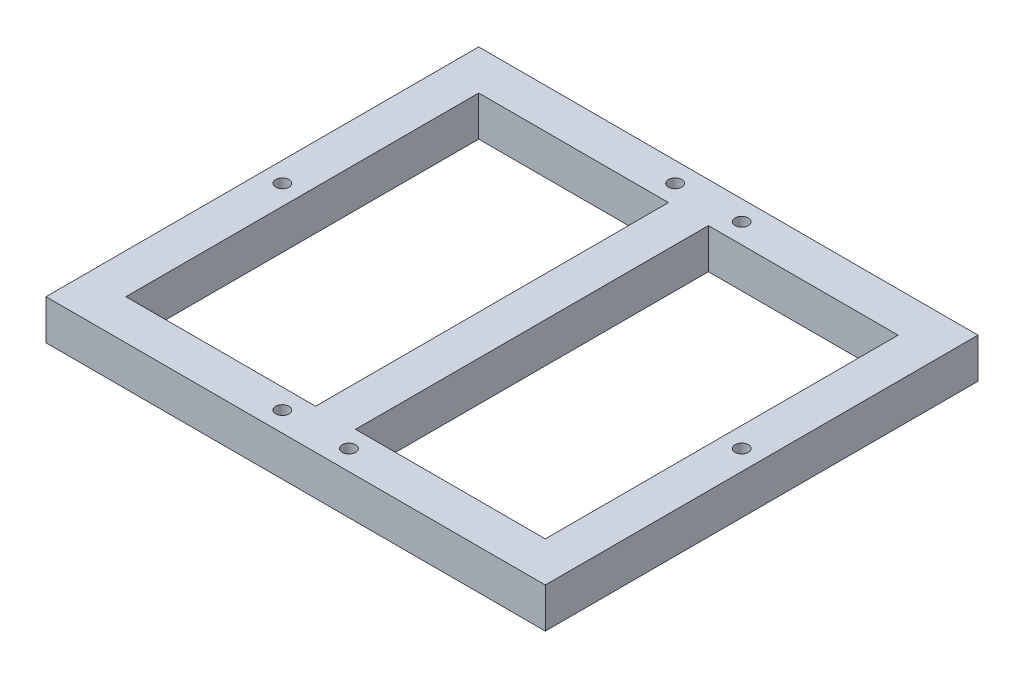
ISO-10303-21;
HEADER;
FILE_DESCRIPTION(('STEP AP214'),'2;1');
FILE_NAME('part.step','',(''),(''),'','','');
FILE_SCHEMA(('AUTOMOTIVE_DESIGN { 1 0 10303 214 1 1 1 1 }'));
ENDSEC;
DATA;
#1=APPLICATION_CONTEXT('core data for automotive mechanical design processes');
#2=APPLICATION_PROTOCOL_DEFINITION('international standard','automotive_design',2000,#1);
#3=PRODUCT_CONTEXT('',#1,'mechanical');
#4=PRODUCT('Part','Part','',(#3));
#5=PRODUCT_RELATED_PRODUCT_CATEGORY('part','',(#4));
#6=PRODUCT_DEFINITION_FORMATION('','',#4);
#7=PRODUCT_DEFINITION_CONTEXT('part definition',#1,'design');
#8=PRODUCT_DEFINITION('design','',#6,#7);
#9=PRODUCT_DEFINITION_SHAPE('','',#8);
#10=(LENGTH_UNIT() NAMED_UNIT(*) SI_UNIT(.MILLI.,.METRE.));
#11=(NAMED_UNIT(*) PLANE_ANGLE_UNIT() SI_UNIT($,.RADIAN.));
#12=(NAMED_UNIT(*) SI_UNIT($,.STERADIAN.) SOLID_ANGLE_UNIT());
#13=UNCERTAINTY_MEASURE_WITH_UNIT(LENGTH_MEASURE(1.E-05),#10,'distance_accuracy_value','');
#14=(GEOMETRIC_REPRESENTATION_CONTEXT(3) GLOBAL_UNCERTAINTY_ASSIGNED_CONTEXT((#13)) GLOBAL_UNIT_ASSIGNED_CONTEXT((#10,
#11,#12)) REPRESENTATION_CONTEXT('',''));
#15=CARTESIAN_POINT('',(0.,0.,0.));
#16=DIRECTION('',(0.,0.,1.));
#17=DIRECTION('',(1.,0.,0.));
#18=AXIS2_PLACEMENT_3D('',#15,#16,#17);
#19=CARTESIAN_POINT('',(0.,6.,0.));
#20=DIRECTION('',(0.,-1.,0.));
#21=DIRECTION('',(0.,0.,-1.));
#22=AXIS2_PLACEMENT_3D('',#19,#20,#21);
#23=PLANE('',#22);
#24=CARTESIAN_POINT('',(-69.,6.,0.));
#25=DIRECTION('',(0.,1.,0.));
#26=DIRECTION('',(0.,0.,1.));
#27=AXIS2_PLACEMENT_3D('',#24,#25,#26);
#28=CIRCLE('',#27,2.);
#29=CARTESIAN_POINT('',(-69.,6.,2.));
#30=VERTEX_POINT('',#29);
#31=EDGE_CURVE('E329',#30,#30,#28,.T.);
#32=ORIENTED_EDGE('',*,*,#31,.F.);
#33=EDGE_LOOP('',(#32));
#34=FACE_BOUND('',#33,.T.);
#35=CARTESIAN_POINT('',(9.99999999999998,6.,-59.));
#36=DIRECTION('',(0.,1.,0.));
#37=DIRECTION('',(0.,0.,1.));
#38=AXIS2_PLACEMENT_3D('',#35,#36,#37);
#39=CIRCLE('',#38,2.);
#40=CARTESIAN_POINT('',(9.99999999999998,6.,-57.));
#41=VERTEX_POINT('',#40);
#42=EDGE_CURVE('E341',#41,#41,#39,.T.);
#43=ORIENTED_EDGE('',*,*,#42,.F.);
#44=EDGE_LOOP('',(#43));
#45=FACE_BOUND('',#44,.T.);
#46=CARTESIAN_POINT('',(69.,6.,0.));
#47=DIRECTION('',(0.,1.,0.));
#48=DIRECTION('',(0.,0.,-1.));
#49=AXIS2_PLACEMENT_3D('',#46,#47,#48);
#50=CIRCLE('',#49,2.);
#51=CARTESIAN_POINT('',(69.,6.,-2.));
#52=VERTEX_POINT('',#51);
#53=EDGE_CURVE('E334',#52,#52,#50,.T.);
#54=ORIENTED_EDGE('',*,*,#53,.F.);
#55=EDGE_LOOP('',(#54));
#56=FACE_BOUND('',#55,.T.);
#57=CARTESIAN_POINT('',(-9.99999999999998,6.,59.));
#58=DIRECTION('',(0.,1.,0.));
#59=DIRECTION('',(0.,0.,1.));
#60=AXIS2_PLACEMENT_3D('',#57,#58,#59);
#61=CIRCLE('',#60,2.);
#62=CARTESIAN_POINT('',(-9.99999999999998,6.,61.));
#63=VERTEX_POINT('',#62);
#64=EDGE_CURVE('E347',#63,#63,#61,.T.);
#65=ORIENTED_EDGE('',*,*,#64,.F.);
#66=EDGE_LOOP('',(#65));
#67=FACE_BOUND('',#66,.T.);
#68=CARTESIAN_POINT('',(9.99999999999998,6.,59.));
#69=DIRECTION('',(0.,1.,0.));
#70=DIRECTION('',(0.,0.,-1.));
#71=AXIS2_PLACEMENT_3D('',#68,#69,#70);
#72=CIRCLE('',#71,2.);
#73=CARTESIAN_POINT('',(9.99999999999998,6.,57.));
#74=VERTEX_POINT('',#73);
#75=EDGE_CURVE('E348',#74,#74,#72,.T.);
#76=ORIENTED_EDGE('',*,*,#75,.F.);
#77=EDGE_LOOP('',(#76));
#78=FACE_BOUND('',#77,.T.);
#79=CARTESIAN_POINT('',(-9.99999999999998,6.,-59.));
#80=DIRECTION('',(0.,1.,0.));
#81=DIRECTION('',(0.,0.,-1.));
#82=AXIS2_PLACEMENT_3D('',#79,#80,#81);
#83=CIRCLE('',#82,2.);
#84=CARTESIAN_POINT('',(-9.99999999999998,6.,-61.));
#85=VERTEX_POINT('',#84);
#86=EDGE_CURVE('E340',#85,#85,#83,.T.);
#87=ORIENTED_EDGE('',*,*,#86,.F.);
#88=EDGE_LOOP('',(#87));
#89=FACE_BOUND('',#88,.T.);
#90=DIRECTION('',(1.,0.,0.));
#91=VECTOR('',#90,1.);
#92=CARTESIAN_POINT('',(-63.,6.,53.));
#93=LINE('',#92,#91);
#94=CARTESIAN_POINT('',(-63.,6.,53.));
#95=VERTEX_POINT('',#94);
#96=CARTESIAN_POINT('',(-5.99999999999999,6.,53.));
#97=VERTEX_POINT('',#96);
#98=EDGE_CURVE('E162',#95,#97,#93,.T.);
#99=ORIENTED_EDGE('',*,*,#98,.F.);
#100=DIRECTION('',(0.,0.,1.));
#101=VECTOR('',#100,1.);
#102=CARTESIAN_POINT('',(-63.,6.,53.));
#103=LINE('',#102,#101);
#104=CARTESIAN_POINT('',(-63.,6.,-53.));
#105=VERTEX_POINT('',#104);
#106=EDGE_CURVE('E170',#105,#95,#103,.T.);
#107=ORIENTED_EDGE('',*,*,#106,.F.);
#108=DIRECTION('',(-1.,0.,0.));
#109=VECTOR('',#108,1.);
#110=CARTESIAN_POINT('',(-63.,6.,-53.));
#111=LINE('',#110,#109);
#112=CARTESIAN_POINT('',(-6.,6.,-53.));
#113=VERTEX_POINT('',#112);
#114=EDGE_CURVE('E167',#113,#105,#111,.T.);
#115=ORIENTED_EDGE('',*,*,#114,.F.);
#116=DIRECTION('',(0.,0.,-1.));
#117=VECTOR('',#116,1.);
#118=CARTESIAN_POINT('',(-6.,6.,-53.));
#119=LINE('',#118,#117);
#120=EDGE_CURVE('E164',#97,#113,#119,.T.);
#121=ORIENTED_EDGE('',*,*,#120,.F.);
#122=EDGE_LOOP('',(#99,#107,#115,#121));
#123=FACE_BOUND('',#122,.T.);
#124=DIRECTION('',(0.,0.,-1.));
#125=VECTOR('',#124,1.);
#126=CARTESIAN_POINT('',(75.,6.,65.));
#127=LINE('',#126,#125);
#128=CARTESIAN_POINT('',(75.,6.,65.));
#129=VERTEX_POINT('',#128);
#130=CARTESIAN_POINT('',(75.,6.,-65.));
#131=VERTEX_POINT('',#130);
#132=EDGE_CURVE('E193',#129,#131,#127,.T.);
#133=ORIENTED_EDGE('',*,*,#132,.T.);
#134=DIRECTION('',(-1.,0.,0.));
#135=VECTOR('',#134,1.);
#136=CARTESIAN_POINT('',(-75.,6.,-65.));
#137=LINE('',#136,#135);
#138=CARTESIAN_POINT('',(-75.,6.,-65.));
#139=VERTEX_POINT('',#138);
#140=EDGE_CURVE('E196',#131,#139,#137,.T.);
#141=ORIENTED_EDGE('',*,*,#140,.T.);
#142=DIRECTION('',(0.,0.,1.));
#143=VECTOR('',#142,1.);
#144=CARTESIAN_POINT('',(-75.,6.,65.));
#145=LINE('',#144,#143);
#146=CARTESIAN_POINT('',(-75.,6.,65.));
#147=VERTEX_POINT('',#146);
#148=EDGE_CURVE('E199',#139,#147,#145,.T.);
#149=ORIENTED_EDGE('',*,*,#148,.T.);
#150=DIRECTION('',(1.,0.,0.));
#151=VECTOR('',#150,1.);
#152=CARTESIAN_POINT('',(-75.,6.,65.));
#153=LINE('',#152,#151);
#154=EDGE_CURVE('E201',#147,#129,#153,.T.);
#155=ORIENTED_EDGE('',*,*,#154,.T.);
#156=EDGE_LOOP('',(#133,#141,#149,#155));
#157=FACE_BOUND('',#156,.T.);
#158=DIRECTION('',(-1.,0.,0.));
#159=VECTOR('',#158,1.);
#160=CARTESIAN_POINT('',(6.,6.,-53.));
#161=LINE('',#160,#159);
#162=CARTESIAN_POINT('',(63.,6.,-53.));
#163=VERTEX_POINT('',#162);
#164=CARTESIAN_POINT('',(6.,6.,-53.));
#165=VERTEX_POINT('',#164);
#166=EDGE_CURVE('E124',#163,#165,#161,.T.);
#167=ORIENTED_EDGE('',*,*,#166,.F.);
#168=DIRECTION('',(0.,0.,-1.));
#169=VECTOR('',#168,1.);
#170=CARTESIAN_POINT('',(63.,6.,53.));
#171=LINE('',#170,#169);
#172=CARTESIAN_POINT('',(63.,6.,53.));
#173=VERTEX_POINT('',#172);
#174=EDGE_CURVE('E146',#173,#163,#171,.T.);
#175=ORIENTED_EDGE('',*,*,#174,.F.);
#176=DIRECTION('',(1.,0.,0.));
#177=VECTOR('',#176,1.);
#178=CARTESIAN_POINT('',(5.99999999999999,6.,53.));
#179=LINE('',#178,#177);
#180=CARTESIAN_POINT('',(5.99999999999999,6.,53.));
#181=VERTEX_POINT('',#180);
#182=EDGE_CURVE('E144',#181,#173,#179,.T.);
#183=ORIENTED_EDGE('',*,*,#182,.F.);
#184=DIRECTION('',(0.,0.,1.));
#185=VECTOR('',#184,1.);
#186=CARTESIAN_POINT('',(6.,6.,-53.));
#187=LINE('',#186,#185);
#188=EDGE_CURVE('E132',#165,#181,#187,.T.);
#189=ORIENTED_EDGE('',*,*,#188,.F.);
#190=EDGE_LOOP('',(#167,#175,#183,#189));
#191=FACE_BOUND('',#190,.T.);
#192=ADVANCED_FACE('F35',(#34,#45,#56,#67,#78,#89,#123,#157,#191),#23,.F.);
#193=CARTESIAN_POINT('',(0.,-6.,0.));
#194=DIRECTION('',(0.,-1.,0.));
#195=DIRECTION('',(0.,0.,-1.));
#196=AXIS2_PLACEMENT_3D('',#193,#194,#195);
#197=PLANE('',#196);
#198=CARTESIAN_POINT('',(-69.,-6.,0.));
#199=DIRECTION('',(0.,1.,0.));
#200=DIRECTION('',(0.,0.,1.));
#201=AXIS2_PLACEMENT_3D('',#198,#199,#200);
#202=CIRCLE('',#201,2.);
#203=CARTESIAN_POINT('',(-69.,-6.,2.));
#204=VERTEX_POINT('',#203);
#205=EDGE_CURVE('E152',#204,#204,#202,.T.);
#206=ORIENTED_EDGE('',*,*,#205,.T.);
#207=EDGE_LOOP('',(#206));
#208=FACE_BOUND('',#207,.T.);
#209=CARTESIAN_POINT('',(9.99999999999998,-6.,-59.));
#210=DIRECTION('',(0.,1.,0.));
#211=DIRECTION('',(0.,0.,1.));
#212=AXIS2_PLACEMENT_3D('',#209,#210,#211);
#213=CIRCLE('',#212,2.);
#214=CARTESIAN_POINT('',(9.99999999999998,-6.,-57.));
#215=VERTEX_POINT('',#214);
#216=EDGE_CURVE('E337',#215,#215,#213,.T.);
#217=ORIENTED_EDGE('',*,*,#216,.T.);
#218=EDGE_LOOP('',(#217));
#219=FACE_BOUND('',#218,.T.);
#220=CARTESIAN_POINT('',(69.,-6.,0.));
#221=DIRECTION('',(0.,1.,0.));
#222=DIRECTION('',(0.,0.,-1.));
#223=AXIS2_PLACEMENT_3D('',#220,#221,#222);
#224=CIRCLE('',#223,2.);
#225=CARTESIAN_POINT('',(69.,-6.,-2.));
#226=VERTEX_POINT('',#225);
#227=EDGE_CURVE('E330',#226,#226,#224,.T.);
#228=ORIENTED_EDGE('',*,*,#227,.T.);
#229=EDGE_LOOP('',(#228));
#230=FACE_BOUND('',#229,.T.);
#231=CARTESIAN_POINT('',(-9.99999999999998,-6.,59.));
#232=DIRECTION('',(0.,1.,0.));
#233=DIRECTION('',(0.,0.,1.));
#234=AXIS2_PLACEMENT_3D('',#231,#232,#233);
#235=CIRCLE('',#234,2.);
#236=CARTESIAN_POINT('',(-9.99999999999998,-6.,61.));
#237=VERTEX_POINT('',#236);
#238=EDGE_CURVE('E358',#237,#237,#235,.T.);
#239=ORIENTED_EDGE('',*,*,#238,.T.);
#240=EDGE_LOOP('',(#239));
#241=FACE_BOUND('',#240,.T.);
#242=CARTESIAN_POINT('',(9.99999999999998,-6.,59.));
#243=DIRECTION('',(0.,1.,0.));
#244=DIRECTION('',(0.,0.,-1.));
#245=AXIS2_PLACEMENT_3D('',#242,#243,#244);
#246=CIRCLE('',#245,2.);
#247=CARTESIAN_POINT('',(9.99999999999998,-6.,57.));
#248=VERTEX_POINT('',#247);
#249=EDGE_CURVE('E344',#248,#248,#246,.T.);
#250=ORIENTED_EDGE('',*,*,#249,.T.);
#251=EDGE_LOOP('',(#250));
#252=FACE_BOUND('',#251,.T.);
#253=CARTESIAN_POINT('',(-9.99999999999998,-6.,-59.));
#254=DIRECTION('',(0.,1.,0.));
#255=DIRECTION('',(0.,0.,-1.));
#256=AXIS2_PLACEMENT_3D('',#253,#254,#255);
#257=CIRCLE('',#256,2.);
#258=CARTESIAN_POINT('',(-9.99999999999998,-6.,-61.));
#259=VERTEX_POINT('',#258);
#260=EDGE_CURVE('E351',#259,#259,#257,.T.);
#261=ORIENTED_EDGE('',*,*,#260,.T.);
#262=EDGE_LOOP('',(#261));
#263=FACE_BOUND('',#262,.T.);
#264=DIRECTION('',(0.,0.,-1.));
#265=VECTOR('',#264,1.);
#266=CARTESIAN_POINT('',(75.,-6.,65.));
#267=LINE('',#266,#265);
#268=CARTESIAN_POINT('',(75.,-6.,65.));
#269=VERTEX_POINT('',#268);
#270=CARTESIAN_POINT('',(75.,-6.,-65.));
#271=VERTEX_POINT('',#270);
#272=EDGE_CURVE('E192',#269,#271,#267,.T.);
#273=ORIENTED_EDGE('',*,*,#272,.F.);
#274=DIRECTION('',(1.,0.,0.));
#275=VECTOR('',#274,1.);
#276=CARTESIAN_POINT('',(-75.,-6.,65.));
#277=LINE('',#276,#275);
#278=CARTESIAN_POINT('',(-75.,-6.,65.));
#279=VERTEX_POINT('',#278);
#280=EDGE_CURVE('E197',#279,#269,#277,.T.);
#281=ORIENTED_EDGE('',*,*,#280,.F.);
#282=DIRECTION('',(0.,0.,1.));
#283=VECTOR('',#282,1.);
#284=CARTESIAN_POINT('',(-75.,-6.,65.));
#285=LINE('',#284,#283);
#286=CARTESIAN_POINT('',(-75.,-6.,-65.));
#287=VERTEX_POINT('',#286);
#288=EDGE_CURVE('E208',#287,#279,#285,.T.);
#289=ORIENTED_EDGE('',*,*,#288,.F.);
#290=DIRECTION('',(-1.,0.,0.));
#291=VECTOR('',#290,1.);
#292=CARTESIAN_POINT('',(-75.,-6.,-65.));
#293=LINE('',#292,#291);
#294=EDGE_CURVE('E206',#271,#287,#293,.T.);
#295=ORIENTED_EDGE('',*,*,#294,.F.);
#296=EDGE_LOOP('',(#273,#281,#289,#295));
#297=FACE_BOUND('',#296,.T.);
#298=DIRECTION('',(0.,0.,1.));
#299=VECTOR('',#298,1.);
#300=CARTESIAN_POINT('',(-63.,-6.,53.));
#301=LINE('',#300,#299);
#302=CARTESIAN_POINT('',(-63.,-6.,-53.));
#303=VERTEX_POINT('',#302);
#304=CARTESIAN_POINT('',(-63.,-6.,53.));
#305=VERTEX_POINT('',#304);
#306=EDGE_CURVE('E165',#303,#305,#301,.T.);
#307=ORIENTED_EDGE('',*,*,#306,.T.);
#308=DIRECTION('',(1.,0.,0.));
#309=VECTOR('',#308,1.);
#310=CARTESIAN_POINT('',(-63.,-6.,53.));
#311=LINE('',#310,#309);
#312=CARTESIAN_POINT('',(-5.99999999999999,-6.,53.));
#313=VERTEX_POINT('',#312);
#314=EDGE_CURVE('E140',#305,#313,#311,.T.);
#315=ORIENTED_EDGE('',*,*,#314,.T.);
#316=DIRECTION('',(0.,0.,-1.));
#317=VECTOR('',#316,1.);
#318=CARTESIAN_POINT('',(-6.,-6.,-53.));
#319=LINE('',#318,#317);
#320=CARTESIAN_POINT('',(-6.,-6.,-53.));
#321=VERTEX_POINT('',#320);
#322=EDGE_CURVE('E175',#313,#321,#319,.T.);
#323=ORIENTED_EDGE('',*,*,#322,.T.);
#324=DIRECTION('',(-1.,0.,0.));
#325=VECTOR('',#324,1.);
#326=CARTESIAN_POINT('',(-63.,-6.,-53.));
#327=LINE('',#326,#325);
#328=EDGE_CURVE('E178',#321,#303,#327,.T.);
#329=ORIENTED_EDGE('',*,*,#328,.T.);
#330=EDGE_LOOP('',(#307,#315,#323,#329));
#331=FACE_BOUND('',#330,.T.);
#332=DIRECTION('',(0.,0.,-1.));
#333=VECTOR('',#332,1.);
#334=CARTESIAN_POINT('',(63.,-6.,53.));
#335=LINE('',#334,#333);
#336=CARTESIAN_POINT('',(63.,-6.,53.));
#337=VERTEX_POINT('',#336);
#338=CARTESIAN_POINT('',(63.,-6.,-53.));
#339=VERTEX_POINT('',#338);
#340=EDGE_CURVE('E133',#337,#339,#335,.T.);
#341=ORIENTED_EDGE('',*,*,#340,.T.);
#342=DIRECTION('',(-1.,0.,0.));
#343=VECTOR('',#342,1.);
#344=CARTESIAN_POINT('',(6.,-6.,-53.));
#345=LINE('',#344,#343);
#346=CARTESIAN_POINT('',(6.,-6.,-53.));
#347=VERTEX_POINT('',#346);
#348=EDGE_CURVE('E58',#339,#347,#345,.T.);
#349=ORIENTED_EDGE('',*,*,#348,.T.);
#350=DIRECTION('',(0.,0.,1.));
#351=VECTOR('',#350,1.);
#352=CARTESIAN_POINT('',(6.,-6.,-53.));
#353=LINE('',#352,#351);
#354=CARTESIAN_POINT('',(5.99999999999999,-6.,53.));
#355=VERTEX_POINT('',#354);
#356=EDGE_CURVE('E139',#347,#355,#353,.T.);
#357=ORIENTED_EDGE('',*,*,#356,.T.);
#358=DIRECTION('',(1.,0.,0.));
#359=VECTOR('',#358,1.);
#360=CARTESIAN_POINT('',(5.99999999999999,-6.,53.));
#361=LINE('',#360,#359);
#362=EDGE_CURVE('E154',#355,#337,#361,.T.);
#363=ORIENTED_EDGE('',*,*,#362,.T.);
#364=EDGE_LOOP('',(#341,#349,#357,#363));
#365=FACE_BOUND('',#364,.T.);
#366=ADVANCED_FACE('F226',(#208,#219,#230,#241,#252,#263,#297,#331,#365),#197,.T.);
#367=CARTESIAN_POINT('',(75.,6.,65.));
#368=DIRECTION('',(-1.,0.,0.));
#369=DIRECTION('',(0.,0.,1.));
#370=AXIS2_PLACEMENT_3D('',#367,#368,#369);
#371=PLANE('',#370);
#372=ORIENTED_EDGE('',*,*,#272,.T.);
#373=DIRECTION('',(0.,-1.,0.));
#374=VECTOR('',#373,1.);
#375=CARTESIAN_POINT('',(75.,6.,-65.));
#376=LINE('',#375,#374);
#377=EDGE_CURVE('E11',#131,#271,#376,.T.);
#378=ORIENTED_EDGE('',*,*,#377,.F.);
#379=ORIENTED_EDGE('',*,*,#132,.F.);
#380=DIRECTION('',(0.,-1.,0.));
#381=VECTOR('',#380,1.);
#382=CARTESIAN_POINT('',(75.,6.,65.));
#383=LINE('',#382,#381);
#384=EDGE_CURVE('E203',#129,#269,#383,.T.);
#385=ORIENTED_EDGE('',*,*,#384,.T.);
#386=EDGE_LOOP('',(#372,#378,#379,#385));
#387=FACE_BOUND('',#386,.T.);
#388=ADVANCED_FACE('F37',(#387),#371,.F.);
#389=CARTESIAN_POINT('',(-75.,6.,-65.));
#390=DIRECTION('',(0.,0.,1.));
#391=DIRECTION('',(1.,0.,0.));
#392=AXIS2_PLACEMENT_3D('',#389,#390,#391);
#393=PLANE('',#392);
#394=ORIENTED_EDGE('',*,*,#294,.T.);
#395=DIRECTION('',(0.,-1.,0.));
#396=VECTOR('',#395,1.);
#397=CARTESIAN_POINT('',(-75.,6.,-65.));
#398=LINE('',#397,#396);
#399=EDGE_CURVE('E43',#139,#287,#398,.T.);
#400=ORIENTED_EDGE('',*,*,#399,.F.);
#401=ORIENTED_EDGE('',*,*,#140,.F.);
#402=ORIENTED_EDGE('',*,*,#377,.T.);
#403=EDGE_LOOP('',(#394,#400,#401,#402));
#404=FACE_BOUND('',#403,.T.);
#405=ADVANCED_FACE('F236',(#404),#393,.F.);
#406=CARTESIAN_POINT('',(-75.,6.,65.));
#407=DIRECTION('',(1.,0.,0.));
#408=DIRECTION('',(0.,0.,-1.));
#409=AXIS2_PLACEMENT_3D('',#406,#407,#408);
#410=PLANE('',#409);
#411=ORIENTED_EDGE('',*,*,#288,.T.);
#412=DIRECTION('',(0.,-1.,0.));
#413=VECTOR('',#412,1.);
#414=CARTESIAN_POINT('',(-75.,6.,65.));
#415=LINE('',#414,#413);
#416=EDGE_CURVE('E213',#147,#279,#415,.T.);
#417=ORIENTED_EDGE('',*,*,#416,.F.);
#418=ORIENTED_EDGE('',*,*,#148,.F.);
#419=ORIENTED_EDGE('',*,*,#399,.T.);
#420=EDGE_LOOP('',(#411,#417,#418,#419));
#421=FACE_BOUND('',#420,.T.);
#422=ADVANCED_FACE('F220',(#421),#410,.F.);
#423=CARTESIAN_POINT('',(-75.,6.,65.));
#424=DIRECTION('',(0.,0.,-1.));
#425=DIRECTION('',(-1.,0.,0.));
#426=AXIS2_PLACEMENT_3D('',#423,#424,#425);
#427=PLANE('',#426);
#428=ORIENTED_EDGE('',*,*,#280,.T.);
#429=ORIENTED_EDGE('',*,*,#384,.F.);
#430=ORIENTED_EDGE('',*,*,#154,.F.);
#431=ORIENTED_EDGE('',*,*,#416,.T.);
#432=EDGE_LOOP('',(#428,#429,#430,#431));
#433=FACE_BOUND('',#432,.T.);
#434=ADVANCED_FACE('F230',(#433),#427,.F.);
#435=CARTESIAN_POINT('',(-63.,6.,53.));
#436=DIRECTION('',(0.,0.,-1.));
#437=DIRECTION('',(-1.,0.,0.));
#438=AXIS2_PLACEMENT_3D('',#435,#436,#437);
#439=PLANE('',#438);
#440=ORIENTED_EDGE('',*,*,#314,.F.);
#441=DIRECTION('',(0.,-1.,0.));
#442=VECTOR('',#441,1.);
#443=CARTESIAN_POINT('',(-63.,6.,53.));
#444=LINE('',#443,#442);
#445=EDGE_CURVE('E172',#95,#305,#444,.T.);
#446=ORIENTED_EDGE('',*,*,#445,.F.);
#447=ORIENTED_EDGE('',*,*,#98,.T.);
#448=DIRECTION('',(0.,-1.,0.));
#449=VECTOR('',#448,1.);
#450=CARTESIAN_POINT('',(-5.99999999999999,6.,53.));
#451=LINE('',#450,#449);
#452=EDGE_CURVE('E189',#97,#313,#451,.T.);
#453=ORIENTED_EDGE('',*,*,#452,.T.);
#454=EDGE_LOOP('',(#440,#446,#447,#453));
#455=FACE_BOUND('',#454,.T.);
#456=ADVANCED_FACE('F254',(#455),#439,.T.);
#457=CARTESIAN_POINT('',(-6.,6.,-53.));
#458=DIRECTION('',(-1.,0.,0.));
#459=DIRECTION('',(0.,0.,1.));
#460=AXIS2_PLACEMENT_3D('',#457,#458,#459);
#461=PLANE('',#460);
#462=ORIENTED_EDGE('',*,*,#322,.F.);
#463=ORIENTED_EDGE('',*,*,#452,.F.);
#464=ORIENTED_EDGE('',*,*,#120,.T.);
#465=DIRECTION('',(0.,-1.,0.));
#466=VECTOR('',#465,1.);
#467=CARTESIAN_POINT('',(-6.,6.,-53.));
#468=LINE('',#467,#466);
#469=EDGE_CURVE('E187',#113,#321,#468,.T.);
#470=ORIENTED_EDGE('',*,*,#469,.T.);
#471=EDGE_LOOP('',(#462,#463,#464,#470));
#472=FACE_BOUND('',#471,.T.);
#473=ADVANCED_FACE('F261',(#472),#461,.T.);
#474=CARTESIAN_POINT('',(-63.,6.,-53.));
#475=DIRECTION('',(0.,0.,1.));
#476=DIRECTION('',(1.,0.,0.));
#477=AXIS2_PLACEMENT_3D('',#474,#475,#476);
#478=PLANE('',#477);
#479=ORIENTED_EDGE('',*,*,#328,.F.);
#480=ORIENTED_EDGE('',*,*,#469,.F.);
#481=ORIENTED_EDGE('',*,*,#114,.T.);
#482=DIRECTION('',(0.,-1.,0.));
#483=VECTOR('',#482,1.);
#484=CARTESIAN_POINT('',(-63.,6.,-53.));
#485=LINE('',#484,#483);
#486=EDGE_CURVE('E185',#105,#303,#485,.T.);
#487=ORIENTED_EDGE('',*,*,#486,.T.);
#488=EDGE_LOOP('',(#479,#480,#481,#487));
#489=FACE_BOUND('',#488,.T.);
#490=ADVANCED_FACE('F266',(#489),#478,.T.);
#491=CARTESIAN_POINT('',(-63.,6.,53.));
#492=DIRECTION('',(1.,0.,0.));
#493=DIRECTION('',(0.,0.,-1.));
#494=AXIS2_PLACEMENT_3D('',#491,#492,#493);
#495=PLANE('',#494);
#496=ORIENTED_EDGE('',*,*,#306,.F.);
#497=ORIENTED_EDGE('',*,*,#486,.F.);
#498=ORIENTED_EDGE('',*,*,#106,.T.);
#499=ORIENTED_EDGE('',*,*,#445,.T.);
#500=EDGE_LOOP('',(#496,#497,#498,#499));
#501=FACE_BOUND('',#500,.T.);
#502=ADVANCED_FACE('F273',(#501),#495,.T.);
#503=CARTESIAN_POINT('',(6.,6.,-53.));
#504=DIRECTION('',(0.,0.,1.));
#505=DIRECTION('',(1.,0.,0.));
#506=AXIS2_PLACEMENT_3D('',#503,#504,#505);
#507=PLANE('',#506);
#508=ORIENTED_EDGE('',*,*,#348,.F.);
#509=DIRECTION('',(0.,-1.,0.));
#510=VECTOR('',#509,1.);
#511=CARTESIAN_POINT('',(63.,6.,-53.));
#512=LINE('',#511,#510);
#513=EDGE_CURVE('E128',#163,#339,#512,.T.);
#514=ORIENTED_EDGE('',*,*,#513,.F.);
#515=ORIENTED_EDGE('',*,*,#166,.T.);
#516=DIRECTION('',(0.,-1.,0.));
#517=VECTOR('',#516,1.);
#518=CARTESIAN_POINT('',(6.,6.,-53.));
#519=LINE('',#518,#517);
#520=EDGE_CURVE('E127',#165,#347,#519,.T.);
#521=ORIENTED_EDGE('',*,*,#520,.T.);
#522=EDGE_LOOP('',(#508,#514,#515,#521));
#523=FACE_BOUND('',#522,.T.);
#524=ADVANCED_FACE('F126',(#523),#507,.T.);
#525=CARTESIAN_POINT('',(6.,6.,-53.));
#526=DIRECTION('',(1.,0.,0.));
#527=DIRECTION('',(0.,0.,-1.));
#528=AXIS2_PLACEMENT_3D('',#525,#526,#527);
#529=PLANE('',#528);
#530=ORIENTED_EDGE('',*,*,#356,.F.);
#531=ORIENTED_EDGE('',*,*,#520,.F.);
#532=ORIENTED_EDGE('',*,*,#188,.T.);
#533=DIRECTION('',(0.,-1.,0.));
#534=VECTOR('',#533,1.);
#535=CARTESIAN_POINT('',(5.99999999999999,6.,53.));
#536=LINE('',#535,#534);
#537=EDGE_CURVE('E141',#181,#355,#536,.T.);
#538=ORIENTED_EDGE('',*,*,#537,.T.);
#539=EDGE_LOOP('',(#530,#531,#532,#538));
#540=FACE_BOUND('',#539,.T.);
#541=ADVANCED_FACE('F136',(#540),#529,.T.);
#542=CARTESIAN_POINT('',(5.99999999999999,6.,53.));
#543=DIRECTION('',(0.,0.,-1.));
#544=DIRECTION('',(-1.,0.,0.));
#545=AXIS2_PLACEMENT_3D('',#542,#543,#544);
#546=PLANE('',#545);
#547=ORIENTED_EDGE('',*,*,#362,.F.);
#548=ORIENTED_EDGE('',*,*,#537,.F.);
#549=ORIENTED_EDGE('',*,*,#182,.T.);
#550=DIRECTION('',(0.,-1.,0.));
#551=VECTOR('',#550,1.);
#552=CARTESIAN_POINT('',(63.,6.,53.));
#553=LINE('',#552,#551);
#554=EDGE_CURVE('E50',#173,#337,#553,.T.);
#555=ORIENTED_EDGE('',*,*,#554,.T.);
#556=EDGE_LOOP('',(#547,#548,#549,#555));
#557=FACE_BOUND('',#556,.T.);
#558=ADVANCED_FACE('F293',(#557),#546,.T.);
#559=CARTESIAN_POINT('',(63.,6.,53.));
#560=DIRECTION('',(-1.,0.,0.));
#561=DIRECTION('',(0.,0.,1.));
#562=AXIS2_PLACEMENT_3D('',#559,#560,#561);
#563=PLANE('',#562);
#564=ORIENTED_EDGE('',*,*,#340,.F.);
#565=ORIENTED_EDGE('',*,*,#554,.F.);
#566=ORIENTED_EDGE('',*,*,#174,.T.);
#567=ORIENTED_EDGE('',*,*,#513,.T.);
#568=EDGE_LOOP('',(#564,#565,#566,#567));
#569=FACE_BOUND('',#568,.T.);
#570=ADVANCED_FACE('F296',(#569),#563,.T.);
#571=CARTESIAN_POINT('',(-9.99999999999998,-6.,-59.));
#572=DIRECTION('',(0.,1.,0.));
#573=DIRECTION('',(0.,0.,1.));
#574=AXIS2_PLACEMENT_3D('',#571,#572,#573);
#575=CYLINDRICAL_SURFACE('',#574,2.);
#576=ORIENTED_EDGE('',*,*,#260,.F.);
#577=EDGE_LOOP('',(#576));
#578=FACE_BOUND('',#577,.T.);
#579=ORIENTED_EDGE('',*,*,#86,.T.);
#580=EDGE_LOOP('',(#579));
#581=FACE_BOUND('',#580,.T.);
#582=ADVANCED_FACE('F300',(#578,#581),#575,.F.);
#583=CARTESIAN_POINT('',(9.99999999999998,-6.,59.));
#584=DIRECTION('',(0.,1.,0.));
#585=DIRECTION('',(0.,0.,1.));
#586=AXIS2_PLACEMENT_3D('',#583,#584,#585);
#587=CYLINDRICAL_SURFACE('',#586,2.);
#588=ORIENTED_EDGE('',*,*,#249,.F.);
#589=EDGE_LOOP('',(#588));
#590=FACE_BOUND('',#589,.T.);
#591=ORIENTED_EDGE('',*,*,#75,.T.);
#592=EDGE_LOOP('',(#591));
#593=FACE_BOUND('',#592,.T.);
#594=ADVANCED_FACE('F305',(#590,#593),#587,.F.);
#595=CARTESIAN_POINT('',(-9.99999999999998,-6.,59.));
#596=DIRECTION('',(0.,1.,0.));
#597=DIRECTION('',(0.,0.,1.));
#598=AXIS2_PLACEMENT_3D('',#595,#596,#597);
#599=CYLINDRICAL_SURFACE('',#598,2.);
#600=ORIENTED_EDGE('',*,*,#238,.F.);
#601=EDGE_LOOP('',(#600));
#602=FACE_BOUND('',#601,.T.);
#603=ORIENTED_EDGE('',*,*,#64,.T.);
#604=EDGE_LOOP('',(#603));
#605=FACE_BOUND('',#604,.T.);
#606=ADVANCED_FACE('F301',(#602,#605),#599,.F.);
#607=CARTESIAN_POINT('',(69.,-6.,0.));
#608=DIRECTION('',(0.,1.,0.));
#609=DIRECTION('',(0.,0.,1.));
#610=AXIS2_PLACEMENT_3D('',#607,#608,#609);
#611=CYLINDRICAL_SURFACE('',#610,2.);
#612=ORIENTED_EDGE('',*,*,#227,.F.);
#613=EDGE_LOOP('',(#612));
#614=FACE_BOUND('',#613,.T.);
#615=ORIENTED_EDGE('',*,*,#53,.T.);
#616=EDGE_LOOP('',(#615));
#617=FACE_BOUND('',#616,.T.);
#618=ADVANCED_FACE('F304',(#614,#617),#611,.F.);
#619=CARTESIAN_POINT('',(9.99999999999998,-6.,-59.));
#620=DIRECTION('',(0.,1.,0.));
#621=DIRECTION('',(0.,0.,1.));
#622=AXIS2_PLACEMENT_3D('',#619,#620,#621);
#623=CYLINDRICAL_SURFACE('',#622,2.);
#624=ORIENTED_EDGE('',*,*,#216,.F.);
#625=EDGE_LOOP('',(#624));
#626=FACE_BOUND('',#625,.T.);
#627=ORIENTED_EDGE('',*,*,#42,.T.);
#628=EDGE_LOOP('',(#627));
#629=FACE_BOUND('',#628,.T.);
#630=ADVANCED_FACE('F309',(#626,#629),#623,.F.);
#631=CARTESIAN_POINT('',(-69.,-6.,0.));
#632=DIRECTION('',(0.,1.,0.));
#633=DIRECTION('',(0.,0.,1.));
#634=AXIS2_PLACEMENT_3D('',#631,#632,#633);
#635=CYLINDRICAL_SURFACE('',#634,2.);
#636=ORIENTED_EDGE('',*,*,#205,.F.);
#637=EDGE_LOOP('',(#636));
#638=FACE_BOUND('',#637,.T.);
#639=ORIENTED_EDGE('',*,*,#31,.T.);
#640=EDGE_LOOP('',(#639));
#641=FACE_BOUND('',#640,.T.);
#642=ADVANCED_FACE('F319',(#638,#641),#635,.F.);
#643=CLOSED_SHELL('',(#192,#366,#388,#405,#422,#434,#456,#473,#490,#502,#524,#541,#558,#570,
#582,#594,#606,#618,#630,#642));
#644=MANIFOLD_SOLID_BREP('B2',#643);
#645=ADVANCED_BREP_SHAPE_REPRESENTATION('',(#18,#644),#14);
#646=SHAPE_DEFINITION_REPRESENTATION(#9,#645);
ENDSEC;
END-ISO-10303-21;
